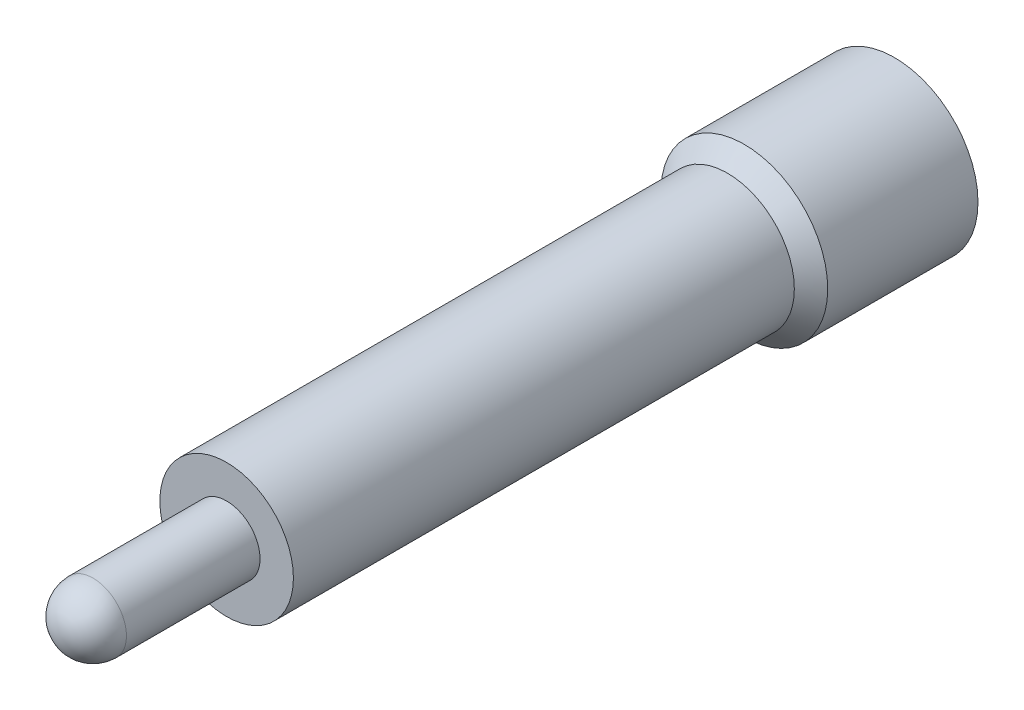
ISO-10303-21;
HEADER;
FILE_DESCRIPTION(('STEP AP214'),'2;1');
FILE_NAME('part.step','',(''),(''),'','','');
FILE_SCHEMA(('AUTOMOTIVE_DESIGN { 1 0 10303 214 1 1 1 1 }'));
ENDSEC;
DATA;
#1=APPLICATION_CONTEXT('core data for automotive mechanical design processes');
#2=APPLICATION_PROTOCOL_DEFINITION('international standard','automotive_design',2000,#1);
#3=PRODUCT_CONTEXT('',#1,'mechanical');
#4=PRODUCT('Part','Part','',(#3));
#5=PRODUCT_RELATED_PRODUCT_CATEGORY('part','',(#4));
#6=PRODUCT_DEFINITION_FORMATION('','',#4);
#7=PRODUCT_DEFINITION_CONTEXT('part definition',#1,'design');
#8=PRODUCT_DEFINITION('design','',#6,#7);
#9=PRODUCT_DEFINITION_SHAPE('','',#8);
#10=(LENGTH_UNIT() NAMED_UNIT(*) SI_UNIT(.MILLI.,.METRE.));
#11=(NAMED_UNIT(*) PLANE_ANGLE_UNIT() SI_UNIT($,.RADIAN.));
#12=(NAMED_UNIT(*) SI_UNIT($,.STERADIAN.) SOLID_ANGLE_UNIT());
#13=UNCERTAINTY_MEASURE_WITH_UNIT(LENGTH_MEASURE(1.E-05),#10,'distance_accuracy_value','');
#14=(GEOMETRIC_REPRESENTATION_CONTEXT(3) GLOBAL_UNCERTAINTY_ASSIGNED_CONTEXT((#13)) GLOBAL_UNIT_ASSIGNED_CONTEXT((#10,
#11,#12)) REPRESENTATION_CONTEXT('',''));
#15=CARTESIAN_POINT('',(0.,0.,0.));
#16=DIRECTION('',(0.,0.,1.));
#17=DIRECTION('',(1.,0.,0.));
#18=AXIS2_PLACEMENT_3D('',#15,#16,#17);
#19=CARTESIAN_POINT('',(0.,0.,10.));
#20=DIRECTION('',(0.,0.,-1.));
#21=DIRECTION('',(-1.,0.,0.));
#22=AXIS2_PLACEMENT_3D('',#19,#20,#21);
#23=CYLINDRICAL_SURFACE('',#22,5.);
#24=CARTESIAN_POINT('',(0.,0.,9.));
#25=DIRECTION('',(0.,0.,1.));
#26=DIRECTION('',(1.,0.,0.));
#27=AXIS2_PLACEMENT_3D('',#24,#25,#26);
#28=CIRCLE('',#27,5.);
#29=CARTESIAN_POINT('',(5.,0.,9.));
#30=VERTEX_POINT('',#29);
#31=EDGE_CURVE('E58',#30,#30,#28,.F.);
#32=ORIENTED_EDGE('',*,*,#31,.T.);
#33=EDGE_LOOP('',(#32));
#34=FACE_BOUND('',#33,.T.);
#35=CARTESIAN_POINT('',(0.,0.,0.));
#36=DIRECTION('',(0.,0.,1.));
#37=DIRECTION('',(1.,0.,0.));
#38=AXIS2_PLACEMENT_3D('',#35,#36,#37);
#39=CIRCLE('',#38,5.);
#40=CARTESIAN_POINT('',(5.,0.,0.));
#41=VERTEX_POINT('',#40);
#42=EDGE_CURVE('E70',#41,#41,#39,.T.);
#43=ORIENTED_EDGE('',*,*,#42,.T.);
#44=EDGE_LOOP('',(#43));
#45=FACE_BOUND('',#44,.T.);
#46=ADVANCED_FACE('F45',(#34,#45),#23,.T.);
#47=CARTESIAN_POINT('',(0.,0.,0.));
#48=DIRECTION('',(0.,0.,1.));
#49=DIRECTION('',(1.,0.,0.));
#50=AXIS2_PLACEMENT_3D('',#47,#48,#49);
#51=PLANE('',#50);
#52=ORIENTED_EDGE('',*,*,#42,.F.);
#53=EDGE_LOOP('',(#52));
#54=FACE_BOUND('',#53,.T.);
#55=ADVANCED_FACE('F82',(#54),#51,.F.);
#56=CARTESIAN_POINT('',(0.,0.,10.));
#57=DIRECTION('',(0.,0.,-1.));
#58=DIRECTION('',(-1.,0.,0.));
#59=AXIS2_PLACEMENT_3D('',#56,#57,#58);
#60=CONICAL_SURFACE('',#59,4.,0.785398163397449);
#61=ORIENTED_EDGE('',*,*,#31,.F.);
#62=EDGE_LOOP('',(#61));
#63=FACE_BOUND('',#62,.T.);
#64=CARTESIAN_POINT('',(0.,0.,10.));
#65=DIRECTION('',(0.,0.,1.));
#66=DIRECTION('',(1.,0.,0.));
#67=AXIS2_PLACEMENT_3D('',#64,#65,#66);
#68=CIRCLE('',#67,4.);
#69=CARTESIAN_POINT('',(4.,0.,10.));
#70=VERTEX_POINT('',#69);
#71=EDGE_CURVE('E64',#70,#70,#68,.T.);
#72=ORIENTED_EDGE('',*,*,#71,.F.);
#73=EDGE_LOOP('',(#72));
#74=FACE_BOUND('',#73,.T.);
#75=ADVANCED_FACE('F80',(#63,#74),#60,.T.);
#76=CARTESIAN_POINT('',(0.,0.,40.));
#77=DIRECTION('',(0.,0.,-1.));
#78=DIRECTION('',(-1.,0.,0.));
#79=AXIS2_PLACEMENT_3D('',#76,#77,#78);
#80=CYLINDRICAL_SURFACE('',#79,4.);
#81=CARTESIAN_POINT('',(0.,0.,40.));
#82=DIRECTION('',(0.,0.,1.));
#83=DIRECTION('',(1.,0.,0.));
#84=AXIS2_PLACEMENT_3D('',#81,#82,#83);
#85=CIRCLE('',#84,4.);
#86=CARTESIAN_POINT('',(4.,0.,40.));
#87=VERTEX_POINT('',#86);
#88=EDGE_CURVE('E66',#87,#87,#85,.T.);
#89=ORIENTED_EDGE('',*,*,#88,.F.);
#90=EDGE_LOOP('',(#89));
#91=FACE_BOUND('',#90,.T.);
#92=ORIENTED_EDGE('',*,*,#71,.T.);
#93=EDGE_LOOP('',(#92));
#94=FACE_BOUND('',#93,.T.);
#95=ADVANCED_FACE('F78',(#91,#94),#80,.T.);
#96=CARTESIAN_POINT('',(0.,0.,40.));
#97=DIRECTION('',(0.,0.,1.));
#98=DIRECTION('',(1.,0.,0.));
#99=AXIS2_PLACEMENT_3D('',#96,#97,#98);
#100=PLANE('',#99);
#101=CARTESIAN_POINT('',(0.,0.,40.));
#102=DIRECTION('',(0.,0.,1.));
#103=DIRECTION('',(1.,0.,0.));
#104=AXIS2_PLACEMENT_3D('',#101,#102,#103);
#105=CIRCLE('',#104,2.);
#106=CARTESIAN_POINT('',(2.,0.,40.));
#107=VERTEX_POINT('',#106);
#108=EDGE_CURVE('E53',#107,#107,#105,.T.);
#109=ORIENTED_EDGE('',*,*,#108,.F.);
#110=EDGE_LOOP('',(#109));
#111=FACE_BOUND('',#110,.T.);
#112=ORIENTED_EDGE('',*,*,#88,.T.);
#113=EDGE_LOOP('',(#112));
#114=FACE_BOUND('',#113,.T.);
#115=ADVANCED_FACE('F88',(#111,#114),#100,.T.);
#116=CARTESIAN_POINT('',(0.,0.,50.));
#117=DIRECTION('',(0.,0.,-1.));
#118=DIRECTION('',(-1.,0.,0.));
#119=AXIS2_PLACEMENT_3D('',#116,#117,#118);
#120=CYLINDRICAL_SURFACE('',#119,2.);
#121=CARTESIAN_POINT('',(0.,0.,48.));
#122=DIRECTION('',(0.,0.,-1.));
#123=DIRECTION('',(-1.,0.,0.));
#124=AXIS2_PLACEMENT_3D('',#121,#122,#123);
#125=CIRCLE('',#124,2.);
#126=CARTESIAN_POINT('',(-2.,0.,48.));
#127=VERTEX_POINT('',#126);
#128=EDGE_CURVE('E10',#127,#127,#125,.T.);
#129=ORIENTED_EDGE('',*,*,#128,.T.);
#130=EDGE_LOOP('',(#129));
#131=FACE_BOUND('',#130,.T.);
#132=ORIENTED_EDGE('',*,*,#108,.T.);
#133=EDGE_LOOP('',(#132));
#134=FACE_BOUND('',#133,.T.);
#135=ADVANCED_FACE('F104',(#131,#134),#120,.T.);
#136=CARTESIAN_POINT('',(0.,0.,48.));
#137=DIRECTION('',(0.,0.,1.));
#138=DIRECTION('',(1.,0.,0.));
#139=AXIS2_PLACEMENT_3D('',#136,#137,#138);
#140=SPHERICAL_SURFACE('',#139,2.);
#141=ORIENTED_EDGE('',*,*,#128,.F.);
#142=EDGE_LOOP('',(#141));
#143=FACE_BOUND('',#142,.T.);
#144=ADVANCED_FACE('F47',(#143),#140,.T.);
#145=CLOSED_SHELL('',(#46,#55,#75,#95,#115,#135,#144));
#146=MANIFOLD_SOLID_BREP('B2',#145);
#147=ADVANCED_BREP_SHAPE_REPRESENTATION('',(#18,#146),#14);
#148=SHAPE_DEFINITION_REPRESENTATION(#9,#147);
ENDSEC;
END-ISO-10303-21;
